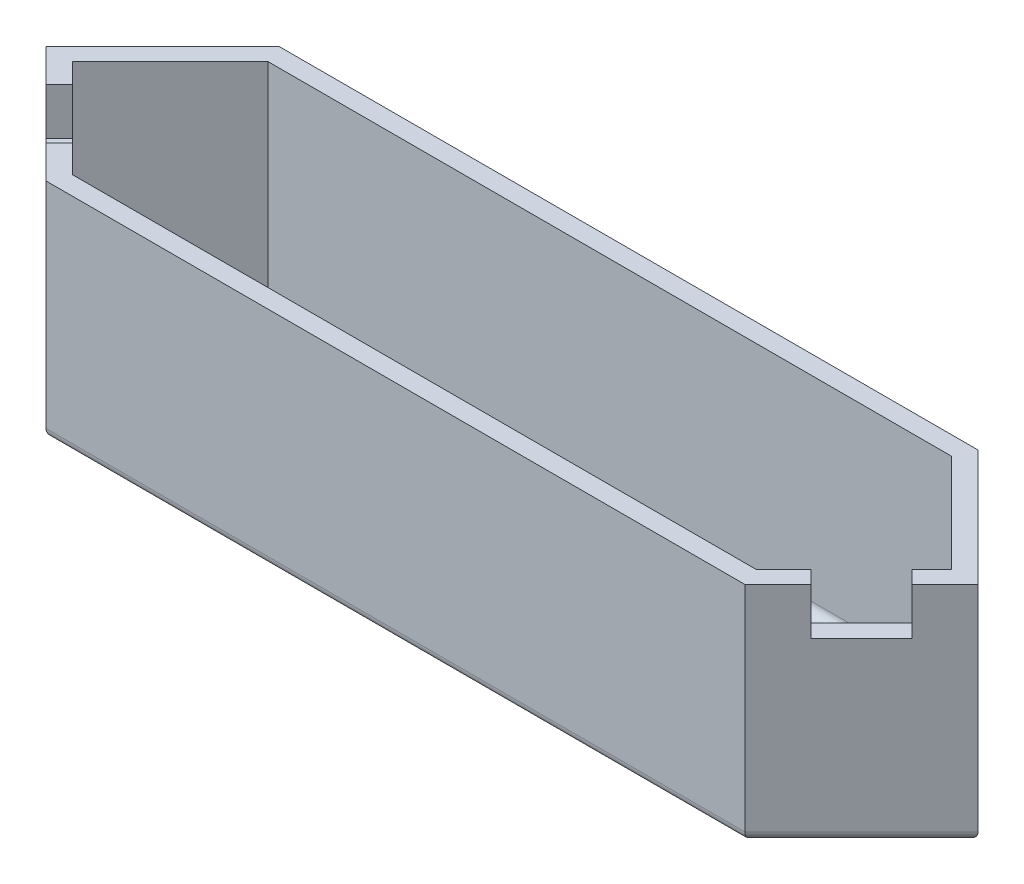
ISO-10303-21;
HEADER;
FILE_DESCRIPTION(('STEP AP214'),'2;1');
FILE_NAME('part.step','',(''),(''),'','','');
FILE_SCHEMA(('AUTOMOTIVE_DESIGN { 1 0 10303 214 1 1 1 1 }'));
ENDSEC;
DATA;
#1=APPLICATION_CONTEXT('core data for automotive mechanical design processes');
#2=APPLICATION_PROTOCOL_DEFINITION('international standard','automotive_design',2000,#1);
#3=PRODUCT_CONTEXT('',#1,'mechanical');
#4=PRODUCT('Part','Part','',(#3));
#5=PRODUCT_RELATED_PRODUCT_CATEGORY('part','',(#4));
#6=PRODUCT_DEFINITION_FORMATION('','',#4);
#7=PRODUCT_DEFINITION_CONTEXT('part definition',#1,'design');
#8=PRODUCT_DEFINITION('design','',#6,#7);
#9=PRODUCT_DEFINITION_SHAPE('','',#8);
#10=(LENGTH_UNIT() NAMED_UNIT(*) SI_UNIT(.MILLI.,.METRE.));
#11=(NAMED_UNIT(*) PLANE_ANGLE_UNIT() SI_UNIT($,.RADIAN.));
#12=(NAMED_UNIT(*) SI_UNIT($,.STERADIAN.) SOLID_ANGLE_UNIT());
#13=UNCERTAINTY_MEASURE_WITH_UNIT(LENGTH_MEASURE(1.E-05),#10,'distance_accuracy_value','');
#14=(GEOMETRIC_REPRESENTATION_CONTEXT(3) GLOBAL_UNCERTAINTY_ASSIGNED_CONTEXT((#13)) GLOBAL_UNIT_ASSIGNED_CONTEXT((#10,
#11,#12)) REPRESENTATION_CONTEXT('',''));
#15=CARTESIAN_POINT('',(0.,0.,0.));
#16=DIRECTION('',(0.,0.,1.));
#17=DIRECTION('',(1.,0.,0.));
#18=AXIS2_PLACEMENT_3D('',#15,#16,#17);
#19=CARTESIAN_POINT('',(0.,48.,0.));
#20=DIRECTION('',(0.,-1.,0.));
#21=DIRECTION('',(0.,0.,-1.));
#22=AXIS2_PLACEMENT_3D('',#19,#20,#21);
#23=PLANE('',#22);
#24=DIRECTION('',(-0.707106781186549,0.,0.707106781186546));
#25=VECTOR('',#24,1.);
#26=CARTESIAN_POINT('',(100.,48.,0.));
#27=LINE('',#26,#25);
#28=CARTESIAN_POINT('',(74.9999999999999,48.,25.));
#29=VERTEX_POINT('',#28);
#30=CARTESIAN_POINT('',(82.0710678118654,48.,17.9289321881345));
#31=VERTEX_POINT('',#30);
#32=EDGE_CURVE('E314',#29,#31,#27,.F.);
#33=ORIENTED_EDGE('',*,*,#32,.T.);
#34=DIRECTION('',(0.707106781186547,0.,0.707106781186548));
#35=VECTOR('',#34,1.);
#36=CARTESIAN_POINT('',(74.9999999999999,48.,10.8578643762691));
#37=LINE('',#36,#35);
#38=CARTESIAN_POINT('',(79.2426406871192,48.,15.1005050633884));
#39=VERTEX_POINT('',#38);
#40=EDGE_CURVE('E229',#39,#31,#37,.T.);
#41=ORIENTED_EDGE('',*,*,#40,.F.);
#42=DIRECTION('',(-0.707106781186547,0.,0.707106781186548));
#43=VECTOR('',#42,1.);
#44=CARTESIAN_POINT('',(47.1715728752538,48.,47.1715728752538));
#45=LINE('',#44,#43);
#46=CARTESIAN_POINT('',(73.3431457505076,48.,21.));
#47=VERTEX_POINT('',#46);
#48=EDGE_CURVE('E268',#39,#47,#45,.T.);
#49=ORIENTED_EDGE('',*,*,#48,.T.);
#50=DIRECTION('',(1.,0.,0.));
#51=VECTOR('',#50,1.);
#52=CARTESIAN_POINT('',(0.,48.,21.));
#53=LINE('',#52,#51);
#54=CARTESIAN_POINT('',(-73.3431457505075,48.,21.));
#55=VERTEX_POINT('',#54);
#56=EDGE_CURVE('E265',#55,#47,#53,.T.);
#57=ORIENTED_EDGE('',*,*,#56,.F.);
#58=DIRECTION('',(0.707106781186548,0.,0.707106781186547));
#59=VECTOR('',#58,1.);
#60=CARTESIAN_POINT('',(-47.1715728752536,48.,47.1715728752538));
#61=LINE('',#60,#59);
#62=CARTESIAN_POINT('',(-79.2426406871192,48.,15.1005050633883));
#63=VERTEX_POINT('',#62);
#64=EDGE_CURVE('E255',#63,#55,#61,.T.);
#65=ORIENTED_EDGE('',*,*,#64,.F.);
#66=DIRECTION('',(-0.707106781186548,0.,0.707106781186547));
#67=VECTOR('',#66,1.);
#68=CARTESIAN_POINT('',(-75.,48.,10.8578643762691));
#69=LINE('',#68,#67);
#70=CARTESIAN_POINT('',(-82.0710678118655,48.,17.9289321881345));
#71=VERTEX_POINT('',#70);
#72=EDGE_CURVE('E256',#63,#71,#69,.T.);
#73=ORIENTED_EDGE('',*,*,#72,.T.);
#74=DIRECTION('',(-0.707106781186546,0.,-0.707106781186549));
#75=VECTOR('',#74,1.);
#76=CARTESIAN_POINT('',(-75.,48.,25.));
#77=LINE('',#76,#75);
#78=CARTESIAN_POINT('',(-75.,48.,25.));
#79=VERTEX_POINT('',#78);
#80=EDGE_CURVE('E306',#71,#79,#77,.F.);
#81=ORIENTED_EDGE('',*,*,#80,.T.);
#82=DIRECTION('',(1.,0.,0.));
#83=VECTOR('',#82,1.);
#84=CARTESIAN_POINT('',(-100.,48.,25.));
#85=LINE('',#84,#83);
#86=EDGE_CURVE('E297',#79,#29,#85,.T.);
#87=ORIENTED_EDGE('',*,*,#86,.T.);
#88=EDGE_LOOP('',(#33,#41,#49,#57,#65,#73,#81,#87));
#89=FACE_BOUND('',#88,.T.);
#90=ADVANCED_FACE('F38',(#89),#23,.F.);
#91=CARTESIAN_POINT('',(-100.,48.,-25.));
#92=DIRECTION('',(0.,0.,1.));
#93=DIRECTION('',(1.,0.,0.));
#94=AXIS2_PLACEMENT_3D('',#91,#92,#93);
#95=PLANE('',#94);
#96=DIRECTION('',(0.,-1.,0.));
#97=VECTOR('',#96,1.);
#98=CARTESIAN_POINT('',(75.,48.,-25.));
#99=LINE('',#98,#97);
#100=CARTESIAN_POINT('',(75.,48.,-25.));
#101=VERTEX_POINT('',#100);
#102=CARTESIAN_POINT('',(75.,2.,-25.));
#103=VERTEX_POINT('',#102);
#104=EDGE_CURVE('E301',#101,#103,#99,.T.);
#105=ORIENTED_EDGE('',*,*,#104,.T.);
#106=DIRECTION('',(-1.,0.,0.));
#107=VECTOR('',#106,1.);
#108=CARTESIAN_POINT('',(-74.9999999999999,2.,-25.));
#109=LINE('',#108,#107);
#110=CARTESIAN_POINT('',(-74.9999999999999,2.,-25.));
#111=VERTEX_POINT('',#110);
#112=EDGE_CURVE('E398',#103,#111,#109,.T.);
#113=ORIENTED_EDGE('',*,*,#112,.T.);
#114=DIRECTION('',(0.,1.,0.));
#115=VECTOR('',#114,1.);
#116=CARTESIAN_POINT('',(-74.9999999999999,48.,-25.));
#117=LINE('',#116,#115);
#118=CARTESIAN_POINT('',(-74.9999999999999,48.,-25.));
#119=VERTEX_POINT('',#118);
#120=EDGE_CURVE('E304',#111,#119,#117,.T.);
#121=ORIENTED_EDGE('',*,*,#120,.T.);
#122=DIRECTION('',(-1.,0.,0.));
#123=VECTOR('',#122,1.);
#124=CARTESIAN_POINT('',(-100.,48.,-25.));
#125=LINE('',#124,#123);
#126=EDGE_CURVE('E294',#101,#119,#125,.T.);
#127=ORIENTED_EDGE('',*,*,#126,.F.);
#128=EDGE_LOOP('',(#105,#113,#121,#127));
#129=FACE_BOUND('',#128,.T.);
#130=ADVANCED_FACE('F433',(#129),#95,.F.);
#131=CARTESIAN_POINT('',(-100.,48.,25.));
#132=DIRECTION('',(0.,0.,-1.));
#133=DIRECTION('',(-1.,0.,0.));
#134=AXIS2_PLACEMENT_3D('',#131,#132,#133);
#135=PLANE('',#134);
#136=DIRECTION('',(0.,-1.,0.));
#137=VECTOR('',#136,1.);
#138=CARTESIAN_POINT('',(-75.,48.,25.));
#139=LINE('',#138,#137);
#140=CARTESIAN_POINT('',(-75.,2.,25.));
#141=VERTEX_POINT('',#140);
#142=EDGE_CURVE('E318',#79,#141,#139,.T.);
#143=ORIENTED_EDGE('',*,*,#142,.T.);
#144=DIRECTION('',(1.,0.,0.));
#145=VECTOR('',#144,1.);
#146=CARTESIAN_POINT('',(74.9999999999999,2.,25.));
#147=LINE('',#146,#145);
#148=CARTESIAN_POINT('',(74.9999999999999,2.,25.));
#149=VERTEX_POINT('',#148);
#150=EDGE_CURVE('E11',#141,#149,#147,.T.);
#151=ORIENTED_EDGE('',*,*,#150,.T.);
#152=DIRECTION('',(0.,1.,0.));
#153=VECTOR('',#152,1.);
#154=CARTESIAN_POINT('',(74.9999999999999,48.,25.));
#155=LINE('',#154,#153);
#156=EDGE_CURVE('E320',#149,#29,#155,.T.);
#157=ORIENTED_EDGE('',*,*,#156,.T.);
#158=ORIENTED_EDGE('',*,*,#86,.F.);
#159=EDGE_LOOP('',(#143,#151,#157,#158));
#160=FACE_BOUND('',#159,.T.);
#161=ADVANCED_FACE('F451',(#160),#135,.F.);
#162=CARTESIAN_POINT('',(94.3431457505076,48.,0.));
#163=VERTEX_POINT('',#162);
#164=CARTESIAN_POINT('',(90.1005050633883,48.,4.24264068711924));
#165=VERTEX_POINT('',#164);
#166=EDGE_CURVE('E269',#163,#165,#45,.T.);
#167=ORIENTED_EDGE('',*,*,#166,.T.);
#168=DIRECTION('',(0.707106781186547,0.,0.707106781186548));
#169=VECTOR('',#168,1.);
#170=CARTESIAN_POINT('',(85.857864376269,48.,0.));
#171=LINE('',#170,#169);
#172=CARTESIAN_POINT('',(92.9289321881345,48.,7.07106781186544));
#173=VERTEX_POINT('',#172);
#174=EDGE_CURVE('E241',#165,#173,#171,.T.);
#175=ORIENTED_EDGE('',*,*,#174,.T.);
#176=CARTESIAN_POINT('',(100.,48.,0.));
#177=VERTEX_POINT('',#176);
#178=EDGE_CURVE('E313',#173,#177,#27,.F.);
#179=ORIENTED_EDGE('',*,*,#178,.T.);
#180=DIRECTION('',(0.707106781186546,0.,0.707106781186549));
#181=VECTOR('',#180,1.);
#182=CARTESIAN_POINT('',(75.,48.,-25.));
#183=LINE('',#182,#181);
#184=EDGE_CURVE('E316',#177,#101,#183,.F.);
#185=ORIENTED_EDGE('',*,*,#184,.T.);
#186=ORIENTED_EDGE('',*,*,#126,.T.);
#187=DIRECTION('',(0.707106781186549,0.,-0.707106781186546));
#188=VECTOR('',#187,1.);
#189=CARTESIAN_POINT('',(-100.,48.,0.));
#190=LINE('',#189,#188);
#191=CARTESIAN_POINT('',(-100.,48.,0.));
#192=VERTEX_POINT('',#191);
#193=EDGE_CURVE('E310',#119,#192,#190,.F.);
#194=ORIENTED_EDGE('',*,*,#193,.T.);
#195=CARTESIAN_POINT('',(-92.9289321881346,48.,7.07106781186542));
#196=VERTEX_POINT('',#195);
#197=EDGE_CURVE('E307',#192,#196,#77,.F.);
#198=ORIENTED_EDGE('',*,*,#197,.T.);
#199=DIRECTION('',(-0.707106781186548,0.,0.707106781186547));
#200=VECTOR('',#199,1.);
#201=CARTESIAN_POINT('',(-85.8578643762691,48.,0.));
#202=LINE('',#201,#200);
#203=CARTESIAN_POINT('',(-90.1005050633884,48.,4.24264068711919));
#204=VERTEX_POINT('',#203);
#205=EDGE_CURVE('E253',#204,#196,#202,.T.);
#206=ORIENTED_EDGE('',*,*,#205,.F.);
#207=CARTESIAN_POINT('',(-94.3431457505075,48.,0.));
#208=VERTEX_POINT('',#207);
#209=EDGE_CURVE('E262',#208,#204,#61,.T.);
#210=ORIENTED_EDGE('',*,*,#209,.F.);
#211=DIRECTION('',(-0.707106781186548,0.,0.707106781186547));
#212=VECTOR('',#211,1.);
#213=CARTESIAN_POINT('',(-47.1715728752538,48.,-47.1715728752538));
#214=LINE('',#213,#212);
#215=CARTESIAN_POINT('',(-73.3431457505075,48.,-21.0000000000001));
#216=VERTEX_POINT('',#215);
#217=EDGE_CURVE('E278',#216,#208,#214,.T.);
#218=ORIENTED_EDGE('',*,*,#217,.F.);
#219=DIRECTION('',(1.,0.,0.));
#220=VECTOR('',#219,1.);
#221=CARTESIAN_POINT('',(0.,48.,-21.0000000000001));
#222=LINE('',#221,#220);
#223=CARTESIAN_POINT('',(73.3431457505076,48.,-21.));
#224=VERTEX_POINT('',#223);
#225=EDGE_CURVE('E275',#216,#224,#222,.T.);
#226=ORIENTED_EDGE('',*,*,#225,.T.);
#227=DIRECTION('',(0.707106781186548,0.,0.707106781186548));
#228=VECTOR('',#227,1.);
#229=CARTESIAN_POINT('',(47.1715728752538,48.,-47.1715728752538));
#230=LINE('',#229,#228);
#231=EDGE_CURVE('E272',#224,#163,#230,.T.);
#232=ORIENTED_EDGE('',*,*,#231,.T.);
#233=EDGE_LOOP('',(#167,#175,#179,#185,#186,#194,#198,#206,#210,#218,#226,#232));
#234=FACE_BOUND('',#233,.T.);
#235=ADVANCED_FACE('F437',(#234),#23,.F.);
#236=CARTESIAN_POINT('',(0.,0.,0.));
#237=DIRECTION('',(0.,-1.,0.));
#238=DIRECTION('',(0.,0.,-1.));
#239=AXIS2_PLACEMENT_3D('',#236,#237,#238);
#240=PLANE('',#239);
#241=DIRECTION('',(1.,0.,0.));
#242=VECTOR('',#241,1.);
#243=CARTESIAN_POINT('',(-75.,0.,23.));
#244=LINE('',#243,#242);
#245=CARTESIAN_POINT('',(74.1715728752537,0.,23.));
#246=VERTEX_POINT('',#245);
#247=CARTESIAN_POINT('',(-74.1715728752538,0.,23.));
#248=VERTEX_POINT('',#247);
#249=EDGE_CURVE('E365',#246,#248,#244,.F.);
#250=ORIENTED_EDGE('',*,*,#249,.T.);
#251=DIRECTION('',(0.707106781186546,0.,0.707106781186549));
#252=VECTOR('',#251,1.);
#253=CARTESIAN_POINT('',(-48.585786437627,0.,48.5857864376269));
#254=LINE('',#253,#252);
#255=CARTESIAN_POINT('',(-97.1715728752538,0.,0.));
#256=VERTEX_POINT('',#255);
#257=EDGE_CURVE('E390',#248,#256,#254,.F.);
#258=ORIENTED_EDGE('',*,*,#257,.T.);
#259=DIRECTION('',(-0.707106781186549,0.,0.707106781186546));
#260=VECTOR('',#259,1.);
#261=CARTESIAN_POINT('',(-48.5857864376267,0.,-48.5857864376269));
#262=LINE('',#261,#260);
#263=CARTESIAN_POINT('',(-74.1715728752537,0.,-23.));
#264=VERTEX_POINT('',#263);
#265=EDGE_CURVE('E388',#256,#264,#262,.F.);
#266=ORIENTED_EDGE('',*,*,#265,.T.);
#267=DIRECTION('',(-1.,0.,0.));
#268=VECTOR('',#267,1.);
#269=CARTESIAN_POINT('',(75.,0.,-23.));
#270=LINE('',#269,#268);
#271=CARTESIAN_POINT('',(74.1715728752538,0.,-23.));
#272=VERTEX_POINT('',#271);
#273=EDGE_CURVE('E386',#264,#272,#270,.F.);
#274=ORIENTED_EDGE('',*,*,#273,.T.);
#275=DIRECTION('',(-0.707106781186546,0.,-0.707106781186549));
#276=VECTOR('',#275,1.);
#277=CARTESIAN_POINT('',(48.585786437627,0.,-48.5857864376269));
#278=LINE('',#277,#276);
#279=CARTESIAN_POINT('',(97.1715728752538,0.,0.));
#280=VERTEX_POINT('',#279);
#281=EDGE_CURVE('E384',#272,#280,#278,.F.);
#282=ORIENTED_EDGE('',*,*,#281,.T.);
#283=DIRECTION('',(0.707106781186549,0.,-0.707106781186546));
#284=VECTOR('',#283,1.);
#285=CARTESIAN_POINT('',(48.5857864376267,0.,48.5857864376269));
#286=LINE('',#285,#284);
#287=EDGE_CURVE('E382',#280,#246,#286,.F.);
#288=ORIENTED_EDGE('',*,*,#287,.T.);
#289=EDGE_LOOP('',(#250,#258,#266,#274,#282,#288));
#290=FACE_BOUND('',#289,.T.);
#291=ADVANCED_FACE('F470',(#290),#240,.T.);
#292=CARTESIAN_POINT('',(-75.,48.,25.));
#293=DIRECTION('',(0.707106781186549,0.,-0.707106781186546));
#294=DIRECTION('',(0.,-1.,0.));
#295=AXIS2_PLACEMENT_3D('',#292,#293,#294);
#296=PLANE('',#295);
#297=DIRECTION('',(0.,1.,0.));
#298=VECTOR('',#297,1.);
#299=CARTESIAN_POINT('',(-100.,48.,0.));
#300=LINE('',#299,#298);
#301=CARTESIAN_POINT('',(-100.,2.,0.));
#302=VERTEX_POINT('',#301);
#303=EDGE_CURVE('E298',#302,#192,#300,.T.);
#304=ORIENTED_EDGE('',*,*,#303,.F.);
#305=DIRECTION('',(-0.707106781186546,0.,-0.707106781186549));
#306=VECTOR('',#305,1.);
#307=CARTESIAN_POINT('',(-75.,2.,25.));
#308=LINE('',#307,#306);
#309=EDGE_CURVE('E393',#302,#141,#308,.F.);
#310=ORIENTED_EDGE('',*,*,#309,.T.);
#311=ORIENTED_EDGE('',*,*,#142,.F.);
#312=ORIENTED_EDGE('',*,*,#80,.F.);
#313=DIRECTION('',(0.,1.,0.));
#314=VECTOR('',#313,1.);
#315=CARTESIAN_POINT('',(-82.0710678118655,48.,17.9289321881345));
#316=LINE('',#315,#314);
#317=CARTESIAN_POINT('',(-82.0710678118655,38.,17.9289321881345));
#318=VERTEX_POINT('',#317);
#319=EDGE_CURVE('E250',#318,#71,#316,.T.);
#320=ORIENTED_EDGE('',*,*,#319,.F.);
#321=DIRECTION('',(0.707106781186547,0.,0.707106781186548));
#322=VECTOR('',#321,1.);
#323=CARTESIAN_POINT('',(-92.9289321881346,38.,7.07106781186542));
#324=LINE('',#323,#322);
#325=CARTESIAN_POINT('',(-92.9289321881346,38.,7.07106781186542));
#326=VERTEX_POINT('',#325);
#327=EDGE_CURVE('E247',#326,#318,#324,.T.);
#328=ORIENTED_EDGE('',*,*,#327,.F.);
#329=DIRECTION('',(0.,-1.,0.));
#330=VECTOR('',#329,1.);
#331=CARTESIAN_POINT('',(-92.9289321881346,48.,7.07106781186542));
#332=LINE('',#331,#330);
#333=EDGE_CURVE('E240',#196,#326,#332,.T.);
#334=ORIENTED_EDGE('',*,*,#333,.F.);
#335=ORIENTED_EDGE('',*,*,#197,.F.);
#336=EDGE_LOOP('',(#304,#310,#311,#312,#320,#328,#334,#335));
#337=FACE_BOUND('',#336,.T.);
#338=ADVANCED_FACE('F456',(#337),#296,.F.);
#339=CARTESIAN_POINT('',(-100.,48.,0.));
#340=DIRECTION('',(0.707106781186546,0.,0.707106781186549));
#341=DIRECTION('',(0.,-1.,0.));
#342=AXIS2_PLACEMENT_3D('',#339,#340,#341);
#343=PLANE('',#342);
#344=ORIENTED_EDGE('',*,*,#120,.F.);
#345=DIRECTION('',(0.707106781186549,0.,-0.707106781186546));
#346=VECTOR('',#345,1.);
#347=CARTESIAN_POINT('',(-100.,2.,0.));
#348=LINE('',#347,#346);
#349=EDGE_CURVE('E396',#111,#302,#348,.F.);
#350=ORIENTED_EDGE('',*,*,#349,.T.);
#351=ORIENTED_EDGE('',*,*,#303,.T.);
#352=ORIENTED_EDGE('',*,*,#193,.F.);
#353=EDGE_LOOP('',(#344,#350,#351,#352));
#354=FACE_BOUND('',#353,.T.);
#355=ADVANCED_FACE('F502',(#354),#343,.F.);
#356=CARTESIAN_POINT('',(100.,48.,0.));
#357=DIRECTION('',(-0.707106781186546,0.,-0.707106781186549));
#358=DIRECTION('',(0.,-1.,0.));
#359=AXIS2_PLACEMENT_3D('',#356,#357,#358);
#360=PLANE('',#359);
#361=ORIENTED_EDGE('',*,*,#156,.F.);
#362=DIRECTION('',(-0.707106781186549,0.,0.707106781186546));
#363=VECTOR('',#362,1.);
#364=CARTESIAN_POINT('',(100.,2.,0.));
#365=LINE('',#364,#363);
#366=CARTESIAN_POINT('',(100.,2.,0.));
#367=VERTEX_POINT('',#366);
#368=EDGE_CURVE('E47',#149,#367,#365,.F.);
#369=ORIENTED_EDGE('',*,*,#368,.T.);
#370=DIRECTION('',(0.,-1.,0.));
#371=VECTOR('',#370,1.);
#372=CARTESIAN_POINT('',(100.,48.,0.));
#373=LINE('',#372,#371);
#374=EDGE_CURVE('E284',#177,#367,#373,.T.);
#375=ORIENTED_EDGE('',*,*,#374,.F.);
#376=ORIENTED_EDGE('',*,*,#178,.F.);
#377=DIRECTION('',(0.,1.,0.));
#378=VECTOR('',#377,1.);
#379=CARTESIAN_POINT('',(92.9289321881345,48.,7.07106781186544));
#380=LINE('',#379,#378);
#381=CARTESIAN_POINT('',(92.9289321881345,38.,7.07106781186544));
#382=VERTEX_POINT('',#381);
#383=EDGE_CURVE('E223',#382,#173,#380,.T.);
#384=ORIENTED_EDGE('',*,*,#383,.F.);
#385=DIRECTION('',(0.707106781186548,0.,-0.707106781186547));
#386=VECTOR('',#385,1.);
#387=CARTESIAN_POINT('',(82.0710678118654,38.,17.9289321881345));
#388=LINE('',#387,#386);
#389=CARTESIAN_POINT('',(82.0710678118654,38.,17.9289321881345));
#390=VERTEX_POINT('',#389);
#391=EDGE_CURVE('E216',#390,#382,#388,.T.);
#392=ORIENTED_EDGE('',*,*,#391,.F.);
#393=DIRECTION('',(0.,-1.,0.));
#394=VECTOR('',#393,1.);
#395=CARTESIAN_POINT('',(82.0710678118654,48.,17.9289321881345));
#396=LINE('',#395,#394);
#397=EDGE_CURVE('E226',#31,#390,#396,.T.);
#398=ORIENTED_EDGE('',*,*,#397,.F.);
#399=ORIENTED_EDGE('',*,*,#32,.F.);
#400=EDGE_LOOP('',(#361,#369,#375,#376,#384,#392,#398,#399));
#401=FACE_BOUND('',#400,.T.);
#402=ADVANCED_FACE('F234',(#401),#360,.F.);
#403=CARTESIAN_POINT('',(75.,48.,-25.));
#404=DIRECTION('',(-0.707106781186549,0.,0.707106781186546));
#405=DIRECTION('',(0.,-1.,0.));
#406=AXIS2_PLACEMENT_3D('',#403,#404,#405);
#407=PLANE('',#406);
#408=ORIENTED_EDGE('',*,*,#374,.T.);
#409=DIRECTION('',(0.707106781186546,0.,0.707106781186549));
#410=VECTOR('',#409,1.);
#411=CARTESIAN_POINT('',(75.,2.,-25.));
#412=LINE('',#411,#410);
#413=EDGE_CURVE('E400',#367,#103,#412,.F.);
#414=ORIENTED_EDGE('',*,*,#413,.T.);
#415=ORIENTED_EDGE('',*,*,#104,.F.);
#416=ORIENTED_EDGE('',*,*,#184,.F.);
#417=EDGE_LOOP('',(#408,#414,#415,#416));
#418=FACE_BOUND('',#417,.T.);
#419=ADVANCED_FACE('F429',(#418),#407,.F.);
#420=CARTESIAN_POINT('',(-47.1715728752536,4.,47.1715728752538));
#421=DIRECTION('',(-0.707106781186547,0.,0.707106781186548));
#422=DIRECTION('',(0.707106781186548,0.,0.707106781186547));
#423=AXIS2_PLACEMENT_3D('',#420,#421,#422);
#424=PLANE('',#423);
#425=DIRECTION('',(0.,1.,0.));
#426=VECTOR('',#425,1.);
#427=CARTESIAN_POINT('',(-73.3431457505075,4.,21.));
#428=LINE('',#427,#426);
#429=CARTESIAN_POINT('',(-73.3431457505075,6.,21.));
#430=VERTEX_POINT('',#429);
#431=EDGE_CURVE('E281',#430,#55,#428,.T.);
#432=ORIENTED_EDGE('',*,*,#431,.F.);
#433=DIRECTION('',(0.707106781186548,0.,0.707106781186547));
#434=VECTOR('',#433,1.);
#435=CARTESIAN_POINT('',(-47.1715728752536,6.,47.1715728752538));
#436=LINE('',#435,#434);
#437=CARTESIAN_POINT('',(-94.3431457505075,6.,0.));
#438=VERTEX_POINT('',#437);
#439=EDGE_CURVE('E361',#430,#438,#436,.F.);
#440=ORIENTED_EDGE('',*,*,#439,.T.);
#441=DIRECTION('',(0.,1.,0.));
#442=VECTOR('',#441,1.);
#443=CARTESIAN_POINT('',(-94.3431457505075,4.,0.));
#444=LINE('',#443,#442);
#445=EDGE_CURVE('E282',#438,#208,#444,.T.);
#446=ORIENTED_EDGE('',*,*,#445,.T.);
#447=ORIENTED_EDGE('',*,*,#209,.T.);
#448=DIRECTION('',(0.,-1.,0.));
#449=VECTOR('',#448,1.);
#450=CARTESIAN_POINT('',(-90.1005050633884,4.,4.24264068711919));
#451=LINE('',#450,#449);
#452=CARTESIAN_POINT('',(-90.1005050633884,38.,4.24264068711919));
#453=VERTEX_POINT('',#452);
#454=EDGE_CURVE('E330',#204,#453,#451,.T.);
#455=ORIENTED_EDGE('',*,*,#454,.T.);
#456=DIRECTION('',(0.707106781186548,0.,0.707106781186547));
#457=VECTOR('',#456,1.);
#458=CARTESIAN_POINT('',(-47.1715728752536,38.,47.1715728752538));
#459=LINE('',#458,#457);
#460=CARTESIAN_POINT('',(-79.2426406871192,38.,15.1005050633883));
#461=VERTEX_POINT('',#460);
#462=EDGE_CURVE('E322',#453,#461,#459,.T.);
#463=ORIENTED_EDGE('',*,*,#462,.T.);
#464=DIRECTION('',(0.,1.,0.));
#465=VECTOR('',#464,1.);
#466=CARTESIAN_POINT('',(-79.2426406871192,4.,15.1005050633883));
#467=LINE('',#466,#465);
#468=EDGE_CURVE('E327',#461,#63,#467,.T.);
#469=ORIENTED_EDGE('',*,*,#468,.T.);
#470=ORIENTED_EDGE('',*,*,#64,.T.);
#471=EDGE_LOOP('',(#432,#440,#446,#447,#455,#463,#469,#470));
#472=FACE_BOUND('',#471,.T.);
#473=ADVANCED_FACE('F510',(#472),#424,.F.);
#474=CARTESIAN_POINT('',(-47.1715728752538,4.,-47.1715728752538));
#475=DIRECTION('',(-0.707106781186547,0.,-0.707106781186548));
#476=DIRECTION('',(-0.707106781186548,0.,0.707106781186547));
#477=AXIS2_PLACEMENT_3D('',#474,#475,#476);
#478=PLANE('',#477);
#479=ORIENTED_EDGE('',*,*,#445,.F.);
#480=DIRECTION('',(-0.707106781186548,0.,0.707106781186547));
#481=VECTOR('',#480,1.);
#482=CARTESIAN_POINT('',(-47.1715728752538,6.,-47.1715728752538));
#483=LINE('',#482,#481);
#484=CARTESIAN_POINT('',(-73.3431457505075,6.,-21.0000000000001));
#485=VERTEX_POINT('',#484);
#486=EDGE_CURVE('E359',#438,#485,#483,.F.);
#487=ORIENTED_EDGE('',*,*,#486,.T.);
#488=DIRECTION('',(0.,1.,0.));
#489=VECTOR('',#488,1.);
#490=CARTESIAN_POINT('',(-73.3431457505075,4.,-21.0000000000001));
#491=LINE('',#490,#489);
#492=EDGE_CURVE('E285',#485,#216,#491,.T.);
#493=ORIENTED_EDGE('',*,*,#492,.T.);
#494=ORIENTED_EDGE('',*,*,#217,.T.);
#495=EDGE_LOOP('',(#479,#487,#493,#494));
#496=FACE_BOUND('',#495,.T.);
#497=ADVANCED_FACE('F612',(#496),#478,.F.);
#498=CARTESIAN_POINT('',(0.,4.,-21.0000000000001));
#499=DIRECTION('',(0.,0.,1.));
#500=DIRECTION('',(1.,0.,0.));
#501=AXIS2_PLACEMENT_3D('',#498,#499,#500);
#502=PLANE('',#501);
#503=ORIENTED_EDGE('',*,*,#492,.F.);
#504=DIRECTION('',(1.,0.,0.));
#505=VECTOR('',#504,1.);
#506=CARTESIAN_POINT('',(73.3431457505076,6.,-21.0000000000001));
#507=LINE('',#506,#505);
#508=CARTESIAN_POINT('',(73.3431457505076,6.,-21.));
#509=VERTEX_POINT('',#508);
#510=EDGE_CURVE('E357',#485,#509,#507,.T.);
#511=ORIENTED_EDGE('',*,*,#510,.T.);
#512=DIRECTION('',(0.,1.,0.));
#513=VECTOR('',#512,1.);
#514=CARTESIAN_POINT('',(73.3431457505076,4.,-21.));
#515=LINE('',#514,#513);
#516=EDGE_CURVE('E287',#509,#224,#515,.T.);
#517=ORIENTED_EDGE('',*,*,#516,.T.);
#518=ORIENTED_EDGE('',*,*,#225,.F.);
#519=EDGE_LOOP('',(#503,#511,#517,#518));
#520=FACE_BOUND('',#519,.T.);
#521=ADVANCED_FACE('F620',(#520),#502,.T.);
#522=CARTESIAN_POINT('',(47.1715728752538,4.,-47.1715728752538));
#523=DIRECTION('',(-0.707106781186548,0.,0.707106781186548));
#524=DIRECTION('',(0.707106781186548,0.,0.707106781186548));
#525=AXIS2_PLACEMENT_3D('',#522,#523,#524);
#526=PLANE('',#525);
#527=ORIENTED_EDGE('',*,*,#516,.F.);
#528=DIRECTION('',(0.707106781186548,0.,0.707106781186548));
#529=VECTOR('',#528,1.);
#530=CARTESIAN_POINT('',(94.3431457505076,6.,0.));
#531=LINE('',#530,#529);
#532=CARTESIAN_POINT('',(94.3431457505076,6.,0.));
#533=VERTEX_POINT('',#532);
#534=EDGE_CURVE('E355',#509,#533,#531,.T.);
#535=ORIENTED_EDGE('',*,*,#534,.T.);
#536=DIRECTION('',(0.,1.,0.));
#537=VECTOR('',#536,1.);
#538=CARTESIAN_POINT('',(94.3431457505076,4.,0.));
#539=LINE('',#538,#537);
#540=EDGE_CURVE('E289',#533,#163,#539,.T.);
#541=ORIENTED_EDGE('',*,*,#540,.T.);
#542=ORIENTED_EDGE('',*,*,#231,.F.);
#543=EDGE_LOOP('',(#527,#535,#541,#542));
#544=FACE_BOUND('',#543,.T.);
#545=ADVANCED_FACE('F629',(#544),#526,.T.);
#546=CARTESIAN_POINT('',(47.1715728752538,4.,47.1715728752538));
#547=DIRECTION('',(-0.707106781186548,0.,-0.707106781186547));
#548=DIRECTION('',(-0.707106781186547,0.,0.707106781186548));
#549=AXIS2_PLACEMENT_3D('',#546,#547,#548);
#550=PLANE('',#549);
#551=ORIENTED_EDGE('',*,*,#540,.F.);
#552=DIRECTION('',(-0.707106781186547,0.,0.707106781186548));
#553=VECTOR('',#552,1.);
#554=CARTESIAN_POINT('',(73.3431457505076,6.,21.));
#555=LINE('',#554,#553);
#556=CARTESIAN_POINT('',(73.3431457505076,6.,21.));
#557=VERTEX_POINT('',#556);
#558=EDGE_CURVE('E339',#533,#557,#555,.T.);
#559=ORIENTED_EDGE('',*,*,#558,.T.);
#560=DIRECTION('',(0.,1.,0.));
#561=VECTOR('',#560,1.);
#562=CARTESIAN_POINT('',(73.3431457505076,4.,21.));
#563=LINE('',#562,#561);
#564=EDGE_CURVE('E291',#557,#47,#563,.T.);
#565=ORIENTED_EDGE('',*,*,#564,.T.);
#566=ORIENTED_EDGE('',*,*,#48,.F.);
#567=DIRECTION('',(0.,1.,0.));
#568=VECTOR('',#567,1.);
#569=CARTESIAN_POINT('',(79.2426406871192,4.,15.1005050633884));
#570=LINE('',#569,#568);
#571=CARTESIAN_POINT('',(79.2426406871192,38.,15.1005050633884));
#572=VERTEX_POINT('',#571);
#573=EDGE_CURVE('E337',#572,#39,#570,.T.);
#574=ORIENTED_EDGE('',*,*,#573,.F.);
#575=DIRECTION('',(-0.707106781186547,0.,0.707106781186548));
#576=VECTOR('',#575,1.);
#577=CARTESIAN_POINT('',(47.1715728752538,38.,47.1715728752538));
#578=LINE('',#577,#576);
#579=CARTESIAN_POINT('',(90.1005050633883,38.,4.24264068711924));
#580=VERTEX_POINT('',#579);
#581=EDGE_CURVE('E219',#580,#572,#578,.T.);
#582=ORIENTED_EDGE('',*,*,#581,.F.);
#583=DIRECTION('',(0.,-1.,0.));
#584=VECTOR('',#583,1.);
#585=CARTESIAN_POINT('',(90.1005050633883,4.,4.24264068711923));
#586=LINE('',#585,#584);
#587=EDGE_CURVE('E334',#165,#580,#586,.T.);
#588=ORIENTED_EDGE('',*,*,#587,.F.);
#589=ORIENTED_EDGE('',*,*,#166,.F.);
#590=EDGE_LOOP('',(#551,#559,#565,#566,#574,#582,#588,#589));
#591=FACE_BOUND('',#590,.T.);
#592=ADVANCED_FACE('F445',(#591),#550,.T.);
#593=CARTESIAN_POINT('',(0.,4.,21.));
#594=DIRECTION('',(0.,0.,1.));
#595=DIRECTION('',(1.,0.,0.));
#596=AXIS2_PLACEMENT_3D('',#593,#594,#595);
#597=PLANE('',#596);
#598=ORIENTED_EDGE('',*,*,#564,.F.);
#599=DIRECTION('',(1.,0.,0.));
#600=VECTOR('',#599,1.);
#601=CARTESIAN_POINT('',(0.,6.,21.));
#602=LINE('',#601,#600);
#603=EDGE_CURVE('E363',#557,#430,#602,.F.);
#604=ORIENTED_EDGE('',*,*,#603,.T.);
#605=ORIENTED_EDGE('',*,*,#431,.T.);
#606=ORIENTED_EDGE('',*,*,#56,.T.);
#607=EDGE_LOOP('',(#598,#604,#605,#606));
#608=FACE_BOUND('',#607,.T.);
#609=ADVANCED_FACE('F646',(#608),#597,.F.);
#610=CARTESIAN_POINT('',(0.,4.,0.));
#611=DIRECTION('',(0.,1.,0.));
#612=DIRECTION('',(0.,0.,1.));
#613=AXIS2_PLACEMENT_3D('',#610,#611,#612);
#614=PLANE('',#613);
#615=DIRECTION('',(1.,0.,0.));
#616=VECTOR('',#615,1.);
#617=CARTESIAN_POINT('',(0.,4.,19.));
#618=LINE('',#617,#616);
#619=CARTESIAN_POINT('',(-72.5147186257613,4.,19.));
#620=VERTEX_POINT('',#619);
#621=CARTESIAN_POINT('',(72.5147186257613,4.,19.));
#622=VERTEX_POINT('',#621);
#623=EDGE_CURVE('E342',#620,#622,#618,.T.);
#624=ORIENTED_EDGE('',*,*,#623,.T.);
#625=DIRECTION('',(-0.707106781186547,0.,0.707106781186548));
#626=VECTOR('',#625,1.);
#627=CARTESIAN_POINT('',(92.9289321881345,4.,-1.41421356237313));
#628=LINE('',#627,#626);
#629=CARTESIAN_POINT('',(91.5147186257614,4.,0.));
#630=VERTEX_POINT('',#629);
#631=EDGE_CURVE('E352',#622,#630,#628,.F.);
#632=ORIENTED_EDGE('',*,*,#631,.T.);
#633=DIRECTION('',(0.707106781186548,0.,0.707106781186548));
#634=VECTOR('',#633,1.);
#635=CARTESIAN_POINT('',(71.9289321881345,4.,-19.5857864376269));
#636=LINE('',#635,#634);
#637=CARTESIAN_POINT('',(72.5147186257614,4.,-19.0000000000001));
#638=VERTEX_POINT('',#637);
#639=EDGE_CURVE('E350',#630,#638,#636,.F.);
#640=ORIENTED_EDGE('',*,*,#639,.T.);
#641=DIRECTION('',(1.,0.,0.));
#642=VECTOR('',#641,1.);
#643=CARTESIAN_POINT('',(-73.3431457505075,4.,-19.0000000000001));
#644=LINE('',#643,#642);
#645=CARTESIAN_POINT('',(-72.5147186257613,4.,-19.0000000000001));
#646=VERTEX_POINT('',#645);
#647=EDGE_CURVE('E348',#638,#646,#644,.F.);
#648=ORIENTED_EDGE('',*,*,#647,.T.);
#649=DIRECTION('',(-0.707106781186548,0.,0.707106781186547));
#650=VECTOR('',#649,1.);
#651=CARTESIAN_POINT('',(-45.7573593128807,4.,-45.7573593128807));
#652=LINE('',#651,#650);
#653=CARTESIAN_POINT('',(-91.5147186257614,4.,0.));
#654=VERTEX_POINT('',#653);
#655=EDGE_CURVE('E346',#646,#654,#652,.T.);
#656=ORIENTED_EDGE('',*,*,#655,.T.);
#657=DIRECTION('',(0.707106781186548,0.,0.707106781186547));
#658=VECTOR('',#657,1.);
#659=CARTESIAN_POINT('',(-45.7573593128806,4.,45.7573593128807));
#660=LINE('',#659,#658);
#661=EDGE_CURVE('E344',#654,#620,#660,.T.);
#662=ORIENTED_EDGE('',*,*,#661,.T.);
#663=EDGE_LOOP('',(#624,#632,#640,#648,#656,#662));
#664=FACE_BOUND('',#663,.T.);
#665=ADVANCED_FACE('F654',(#664),#614,.T.);
#666=CARTESIAN_POINT('',(-85.8578643762691,48.,0.));
#667=DIRECTION('',(-0.707106781186547,0.,-0.707106781186548));
#668=DIRECTION('',(-0.707106781186548,0.,0.707106781186547));
#669=AXIS2_PLACEMENT_3D('',#666,#667,#668);
#670=PLANE('',#669);
#671=ORIENTED_EDGE('',*,*,#205,.T.);
#672=ORIENTED_EDGE('',*,*,#333,.T.);
#673=DIRECTION('',(-0.707106781186548,0.,0.707106781186547));
#674=VECTOR('',#673,1.);
#675=CARTESIAN_POINT('',(-85.8578643762691,38.,0.));
#676=LINE('',#675,#674);
#677=EDGE_CURVE('E252',#453,#326,#676,.T.);
#678=ORIENTED_EDGE('',*,*,#677,.F.);
#679=ORIENTED_EDGE('',*,*,#454,.F.);
#680=EDGE_LOOP('',(#671,#672,#678,#679));
#681=FACE_BOUND('',#680,.T.);
#682=ADVANCED_FACE('F663',(#681),#670,.F.);
#683=CARTESIAN_POINT('',(-75.,48.,10.8578643762691));
#684=DIRECTION('',(0.707106781186547,0.,0.707106781186548));
#685=DIRECTION('',(0.707106781186548,0.,-0.707106781186547));
#686=AXIS2_PLACEMENT_3D('',#683,#684,#685);
#687=PLANE('',#686);
#688=DIRECTION('',(-0.707106781186548,0.,0.707106781186547));
#689=VECTOR('',#688,1.);
#690=CARTESIAN_POINT('',(-75.,38.,10.8578643762691));
#691=LINE('',#690,#689);
#692=EDGE_CURVE('E259',#461,#318,#691,.T.);
#693=ORIENTED_EDGE('',*,*,#692,.T.);
#694=ORIENTED_EDGE('',*,*,#319,.T.);
#695=ORIENTED_EDGE('',*,*,#72,.F.);
#696=ORIENTED_EDGE('',*,*,#468,.F.);
#697=EDGE_LOOP('',(#693,#694,#695,#696));
#698=FACE_BOUND('',#697,.T.);
#699=ADVANCED_FACE('F678',(#698),#687,.F.);
#700=CARTESIAN_POINT('',(-85.8578643762691,38.,0.));
#701=DIRECTION('',(0.,-1.,0.));
#702=DIRECTION('',(0.,0.,-1.));
#703=AXIS2_PLACEMENT_3D('',#700,#701,#702);
#704=PLANE('',#703);
#705=ORIENTED_EDGE('',*,*,#677,.T.);
#706=ORIENTED_EDGE('',*,*,#327,.T.);
#707=ORIENTED_EDGE('',*,*,#692,.F.);
#708=ORIENTED_EDGE('',*,*,#462,.F.);
#709=EDGE_LOOP('',(#705,#706,#707,#708));
#710=FACE_BOUND('',#709,.T.);
#711=ADVANCED_FACE('F687',(#710),#704,.F.);
#712=CARTESIAN_POINT('',(74.9999999999999,48.,10.8578643762691));
#713=DIRECTION('',(-0.707106781186548,0.,0.707106781186547));
#714=DIRECTION('',(0.707106781186547,0.,0.707106781186548));
#715=AXIS2_PLACEMENT_3D('',#712,#713,#714);
#716=PLANE('',#715);
#717=ORIENTED_EDGE('',*,*,#573,.T.);
#718=ORIENTED_EDGE('',*,*,#40,.T.);
#719=ORIENTED_EDGE('',*,*,#397,.T.);
#720=DIRECTION('',(0.707106781186547,0.,0.707106781186548));
#721=VECTOR('',#720,1.);
#722=CARTESIAN_POINT('',(74.9999999999999,38.,10.8578643762691));
#723=LINE('',#722,#721);
#724=EDGE_CURVE('E212',#572,#390,#723,.T.);
#725=ORIENTED_EDGE('',*,*,#724,.F.);
#726=EDGE_LOOP('',(#717,#718,#719,#725));
#727=FACE_BOUND('',#726,.T.);
#728=ADVANCED_FACE('F227',(#727),#716,.F.);
#729=CARTESIAN_POINT('',(85.857864376269,48.,0.));
#730=DIRECTION('',(0.707106781186548,0.,-0.707106781186547));
#731=DIRECTION('',(-0.707106781186547,0.,-0.707106781186548));
#732=AXIS2_PLACEMENT_3D('',#729,#730,#731);
#733=PLANE('',#732);
#734=ORIENTED_EDGE('',*,*,#587,.T.);
#735=DIRECTION('',(0.707106781186547,0.,0.707106781186548));
#736=VECTOR('',#735,1.);
#737=CARTESIAN_POINT('',(85.857864376269,38.,0.));
#738=LINE('',#737,#736);
#739=EDGE_CURVE('E222',#580,#382,#738,.T.);
#740=ORIENTED_EDGE('',*,*,#739,.T.);
#741=ORIENTED_EDGE('',*,*,#383,.T.);
#742=ORIENTED_EDGE('',*,*,#174,.F.);
#743=EDGE_LOOP('',(#734,#740,#741,#742));
#744=FACE_BOUND('',#743,.T.);
#745=ADVANCED_FACE('F442',(#744),#733,.F.);
#746=CARTESIAN_POINT('',(74.9999999999999,38.,10.8578643762691));
#747=DIRECTION('',(0.,-1.,0.));
#748=DIRECTION('',(0.,0.,-1.));
#749=AXIS2_PLACEMENT_3D('',#746,#747,#748);
#750=PLANE('',#749);
#751=ORIENTED_EDGE('',*,*,#581,.T.);
#752=ORIENTED_EDGE('',*,*,#724,.T.);
#753=ORIENTED_EDGE('',*,*,#391,.T.);
#754=ORIENTED_EDGE('',*,*,#739,.F.);
#755=EDGE_LOOP('',(#751,#752,#753,#754));
#756=FACE_BOUND('',#755,.T.);
#757=ADVANCED_FACE('F214',(#756),#750,.F.);
#758=CARTESIAN_POINT('',(-45.7573593128807,6.,-45.7573593128807));
#759=DIRECTION('',(-0.707106781186548,0.,0.707106781186547));
#760=DIRECTION('',(0.707106781186547,0.,0.707106781186548));
#761=AXIS2_PLACEMENT_3D('',#758,#759,#760);
#762=CYLINDRICAL_SURFACE('',#761,2.);
#763=CARTESIAN_POINT('',(-91.5147186257614,6.,0.));
#764=DIRECTION('',(0.,0.,1.));
#765=DIRECTION('',(-1.,0.,0.));
#766=AXIS2_PLACEMENT_3D('',#763,#764,#765);
#767=ELLIPSE('',#766,2.82842712474619,2.);
#768=EDGE_CURVE('E376',#654,#438,#767,.F.);
#769=ORIENTED_EDGE('',*,*,#768,.F.);
#770=ORIENTED_EDGE('',*,*,#655,.F.);
#771=CARTESIAN_POINT('',(-72.5147186257613,6.,-19.0000000000001));
#772=DIRECTION('',(-0.923879532511287,0.,0.38268343236509));
#773=DIRECTION('',(-0.38268343236509,0.,-0.923879532511287));
#774=AXIS2_PLACEMENT_3D('',#771,#772,#773);
#775=ELLIPSE('',#774,2.16478440058479,2.);
#776=EDGE_CURVE('E232',#485,#646,#775,.T.);
#777=ORIENTED_EDGE('',*,*,#776,.F.);
#778=ORIENTED_EDGE('',*,*,#486,.F.);
#779=EDGE_LOOP('',(#769,#770,#777,#778));
#780=FACE_BOUND('',#779,.T.);
#781=ADVANCED_FACE('F532',(#780),#762,.F.);
#782=CARTESIAN_POINT('',(0.,6.,-19.0000000000001));
#783=DIRECTION('',(-1.,0.,0.));
#784=DIRECTION('',(0.,0.,1.));
#785=AXIS2_PLACEMENT_3D('',#782,#783,#784);
#786=CYLINDRICAL_SURFACE('',#785,2.);
#787=ORIENTED_EDGE('',*,*,#776,.T.);
#788=ORIENTED_EDGE('',*,*,#647,.F.);
#789=CARTESIAN_POINT('',(72.5147186257614,6.,-19.0000000000001));
#790=DIRECTION('',(-0.923879532511287,0.,-0.38268343236509));
#791=DIRECTION('',(0.38268343236509,0.,-0.923879532511287));
#792=AXIS2_PLACEMENT_3D('',#789,#790,#791);
#793=ELLIPSE('',#792,2.16478440058479,2.);
#794=EDGE_CURVE('E373',#509,#638,#793,.T.);
#795=ORIENTED_EDGE('',*,*,#794,.F.);
#796=ORIENTED_EDGE('',*,*,#510,.F.);
#797=EDGE_LOOP('',(#787,#788,#795,#796));
#798=FACE_BOUND('',#797,.T.);
#799=ADVANCED_FACE('F528',(#798),#786,.F.);
#800=CARTESIAN_POINT('',(-45.7573593128806,6.,45.7573593128807));
#801=DIRECTION('',(0.707106781186548,0.,0.707106781186547));
#802=DIRECTION('',(0.707106781186547,0.,-0.707106781186548));
#803=AXIS2_PLACEMENT_3D('',#800,#801,#802);
#804=CYLINDRICAL_SURFACE('',#803,2.);
#805=ORIENTED_EDGE('',*,*,#768,.T.);
#806=ORIENTED_EDGE('',*,*,#439,.F.);
#807=CARTESIAN_POINT('',(-72.5147186257613,6.,19.));
#808=DIRECTION('',(0.923879532511287,0.,0.382683432365089));
#809=DIRECTION('',(-0.382683432365089,0.,0.923879532511287));
#810=AXIS2_PLACEMENT_3D('',#807,#808,#809);
#811=ELLIPSE('',#810,2.16478440058479,2.);
#812=EDGE_CURVE('E370',#620,#430,#811,.F.);
#813=ORIENTED_EDGE('',*,*,#812,.F.);
#814=ORIENTED_EDGE('',*,*,#661,.F.);
#815=EDGE_LOOP('',(#805,#806,#813,#814));
#816=FACE_BOUND('',#815,.T.);
#817=ADVANCED_FACE('F524',(#816),#804,.F.);
#818=CARTESIAN_POINT('',(45.7573593128807,6.,-45.7573593128807));
#819=DIRECTION('',(-0.707106781186548,0.,-0.707106781186548));
#820=DIRECTION('',(-0.707106781186548,0.,0.707106781186548));
#821=AXIS2_PLACEMENT_3D('',#818,#819,#820);
#822=CYLINDRICAL_SURFACE('',#821,2.);
#823=ORIENTED_EDGE('',*,*,#794,.T.);
#824=ORIENTED_EDGE('',*,*,#639,.F.);
#825=CARTESIAN_POINT('',(91.5147186257614,6.,0.));
#826=DIRECTION('',(0.,0.,-1.));
#827=DIRECTION('',(1.,0.,0.));
#828=AXIS2_PLACEMENT_3D('',#825,#826,#827);
#829=ELLIPSE('',#828,2.82842712474619,2.);
#830=EDGE_CURVE('E368',#533,#630,#829,.T.);
#831=ORIENTED_EDGE('',*,*,#830,.F.);
#832=ORIENTED_EDGE('',*,*,#534,.F.);
#833=EDGE_LOOP('',(#823,#824,#831,#832));
#834=FACE_BOUND('',#833,.T.);
#835=ADVANCED_FACE('F520',(#834),#822,.F.);
#836=CARTESIAN_POINT('',(0.,6.,19.));
#837=DIRECTION('',(1.,0.,0.));
#838=DIRECTION('',(0.,0.,-1.));
#839=AXIS2_PLACEMENT_3D('',#836,#837,#838);
#840=CYLINDRICAL_SURFACE('',#839,2.);
#841=ORIENTED_EDGE('',*,*,#812,.T.);
#842=ORIENTED_EDGE('',*,*,#603,.F.);
#843=CARTESIAN_POINT('',(72.5147186257613,6.,19.));
#844=DIRECTION('',(0.923879532511287,0.,-0.38268343236509));
#845=DIRECTION('',(-0.38268343236509,0.,-0.923879532511287));
#846=AXIS2_PLACEMENT_3D('',#843,#844,#845);
#847=ELLIPSE('',#846,2.16478440058479,2.);
#848=EDGE_CURVE('E366',#622,#557,#847,.F.);
#849=ORIENTED_EDGE('',*,*,#848,.F.);
#850=ORIENTED_EDGE('',*,*,#623,.F.);
#851=EDGE_LOOP('',(#841,#842,#849,#850));
#852=FACE_BOUND('',#851,.T.);
#853=ADVANCED_FACE('F516',(#852),#840,.F.);
#854=CARTESIAN_POINT('',(45.7573593128807,6.,45.7573593128807));
#855=DIRECTION('',(0.707106781186547,0.,-0.707106781186548));
#856=DIRECTION('',(-0.707106781186548,0.,-0.707106781186547));
#857=AXIS2_PLACEMENT_3D('',#854,#855,#856);
#858=CYLINDRICAL_SURFACE('',#857,2.);
#859=ORIENTED_EDGE('',*,*,#830,.T.);
#860=ORIENTED_EDGE('',*,*,#631,.F.);
#861=ORIENTED_EDGE('',*,*,#848,.T.);
#862=ORIENTED_EDGE('',*,*,#558,.F.);
#863=EDGE_LOOP('',(#859,#860,#861,#862));
#864=FACE_BOUND('',#863,.T.);
#865=ADVANCED_FACE('F513',(#864),#858,.F.);
#866=CARTESIAN_POINT('',(48.585786437627,2.,-48.5857864376269));
#867=DIRECTION('',(-0.707106781186546,0.,-0.707106781186549));
#868=DIRECTION('',(-0.707106781186549,0.,0.707106781186546));
#869=AXIS2_PLACEMENT_3D('',#866,#867,#868);
#870=CYLINDRICAL_SURFACE('',#869,2.);
#871=CARTESIAN_POINT('',(74.1715728752538,2.,-23.));
#872=DIRECTION('',(-0.923879532511287,0.,-0.382683432365091));
#873=DIRECTION('',(0.382683432365091,0.,-0.923879532511286));
#874=AXIS2_PLACEMENT_3D('',#871,#872,#873);
#875=ELLIPSE('',#874,2.16478440058479,2.);
#876=EDGE_CURVE('E412',#103,#272,#875,.T.);
#877=ORIENTED_EDGE('',*,*,#876,.F.);
#878=ORIENTED_EDGE('',*,*,#413,.F.);
#879=CARTESIAN_POINT('',(97.1715728752538,2.,0.));
#880=DIRECTION('',(0.,0.,-1.));
#881=DIRECTION('',(1.,0.,0.));
#882=AXIS2_PLACEMENT_3D('',#879,#880,#881);
#883=ELLIPSE('',#882,2.82842712474619,2.);
#884=EDGE_CURVE('E42',#280,#367,#883,.F.);
#885=ORIENTED_EDGE('',*,*,#884,.F.);
#886=ORIENTED_EDGE('',*,*,#281,.F.);
#887=EDGE_LOOP('',(#877,#878,#885,#886));
#888=FACE_BOUND('',#887,.T.);
#889=ADVANCED_FACE('F40',(#888),#870,.T.);
#890=CARTESIAN_POINT('',(48.5857864376268,2.,48.5857864376269));
#891=DIRECTION('',(0.707106781186549,0.,-0.707106781186546));
#892=DIRECTION('',(-0.707106781186546,0.,-0.707106781186549));
#893=AXIS2_PLACEMENT_3D('',#890,#891,#892);
#894=CYLINDRICAL_SURFACE('',#893,2.);
#895=ORIENTED_EDGE('',*,*,#884,.T.);
#896=ORIENTED_EDGE('',*,*,#368,.F.);
#897=CARTESIAN_POINT('',(74.1715728752538,2.,23.));
#898=DIRECTION('',(-0.923879532511287,0.,0.382683432365089));
#899=DIRECTION('',(-0.382683432365089,0.,-0.923879532511287));
#900=AXIS2_PLACEMENT_3D('',#897,#898,#899);
#901=ELLIPSE('',#900,2.16478440058479,2.);
#902=EDGE_CURVE('E410',#246,#149,#901,.T.);
#903=ORIENTED_EDGE('',*,*,#902,.F.);
#904=ORIENTED_EDGE('',*,*,#287,.F.);
#905=EDGE_LOOP('',(#895,#896,#903,#904));
#906=FACE_BOUND('',#905,.T.);
#907=ADVANCED_FACE('F422',(#906),#894,.T.);
#908=CARTESIAN_POINT('',(-100.,2.,-23.));
#909=DIRECTION('',(1.,0.,0.));
#910=DIRECTION('',(0.,0.,-1.));
#911=AXIS2_PLACEMENT_3D('',#908,#909,#910);
#912=CYLINDRICAL_SURFACE('',#911,2.);
#913=ORIENTED_EDGE('',*,*,#876,.T.);
#914=ORIENTED_EDGE('',*,*,#273,.F.);
#915=CARTESIAN_POINT('',(-74.1715728752538,2.,-23.));
#916=DIRECTION('',(0.923879532511287,0.,-0.382683432365089));
#917=DIRECTION('',(0.382683432365089,0.,0.923879532511287));
#918=AXIS2_PLACEMENT_3D('',#915,#916,#917);
#919=ELLIPSE('',#918,2.16478440058479,2.);
#920=EDGE_CURVE('E407',#111,#264,#919,.F.);
#921=ORIENTED_EDGE('',*,*,#920,.F.);
#922=ORIENTED_EDGE('',*,*,#112,.F.);
#923=EDGE_LOOP('',(#913,#914,#921,#922));
#924=FACE_BOUND('',#923,.T.);
#925=ADVANCED_FACE('F475',(#924),#912,.T.);
#926=CARTESIAN_POINT('',(-100.,2.,23.));
#927=DIRECTION('',(-1.,0.,0.));
#928=DIRECTION('',(0.,0.,1.));
#929=AXIS2_PLACEMENT_3D('',#926,#927,#928);
#930=CYLINDRICAL_SURFACE('',#929,2.);
#931=ORIENTED_EDGE('',*,*,#902,.T.);
#932=ORIENTED_EDGE('',*,*,#150,.F.);
#933=CARTESIAN_POINT('',(-74.1715728752538,2.,23.));
#934=DIRECTION('',(-0.923879532511287,0.,-0.382683432365091));
#935=DIRECTION('',(-0.382683432365091,0.,0.923879532511286));
#936=AXIS2_PLACEMENT_3D('',#933,#934,#935);
#937=ELLIPSE('',#936,2.16478440058479,2.);
#938=EDGE_CURVE('E405',#248,#141,#937,.T.);
#939=ORIENTED_EDGE('',*,*,#938,.F.);
#940=ORIENTED_EDGE('',*,*,#249,.F.);
#941=EDGE_LOOP('',(#931,#932,#939,#940));
#942=FACE_BOUND('',#941,.T.);
#943=ADVANCED_FACE('F473',(#942),#930,.T.);
#944=CARTESIAN_POINT('',(-48.5857864376268,2.,-48.5857864376269));
#945=DIRECTION('',(-0.707106781186549,0.,0.707106781186546));
#946=DIRECTION('',(0.707106781186546,0.,0.707106781186549));
#947=AXIS2_PLACEMENT_3D('',#944,#945,#946);
#948=CYLINDRICAL_SURFACE('',#947,2.);
#949=ORIENTED_EDGE('',*,*,#920,.T.);
#950=ORIENTED_EDGE('',*,*,#265,.F.);
#951=CARTESIAN_POINT('',(-97.1715728752538,2.,0.));
#952=DIRECTION('',(0.,0.,1.));
#953=DIRECTION('',(-1.,0.,0.));
#954=AXIS2_PLACEMENT_3D('',#951,#952,#953);
#955=ELLIPSE('',#954,2.82842712474619,2.);
#956=EDGE_CURVE('E403',#302,#256,#955,.T.);
#957=ORIENTED_EDGE('',*,*,#956,.F.);
#958=ORIENTED_EDGE('',*,*,#349,.F.);
#959=EDGE_LOOP('',(#949,#950,#957,#958));
#960=FACE_BOUND('',#959,.T.);
#961=ADVANCED_FACE('F467',(#960),#948,.T.);
#962=CARTESIAN_POINT('',(-48.585786437627,2.,48.5857864376269));
#963=DIRECTION('',(0.707106781186546,0.,0.707106781186549));
#964=DIRECTION('',(0.707106781186549,0.,-0.707106781186546));
#965=AXIS2_PLACEMENT_3D('',#962,#963,#964);
#966=CYLINDRICAL_SURFACE('',#965,2.);
#967=ORIENTED_EDGE('',*,*,#938,.T.);
#968=ORIENTED_EDGE('',*,*,#309,.F.);
#969=ORIENTED_EDGE('',*,*,#956,.T.);
#970=ORIENTED_EDGE('',*,*,#257,.F.);
#971=EDGE_LOOP('',(#967,#968,#969,#970));
#972=FACE_BOUND('',#971,.T.);
#973=ADVANCED_FACE('F461',(#972),#966,.T.);
#974=CLOSED_SHELL('',(#90,#130,#161,#235,#291,#338,#355,#402,#419,#473,#497,#521,#545,#592,#609,
#665,#682,#699,#711,#728,#745,#757,#781,#799,#817,#835,#853,#865,#889,#907,#925,#943,#961,#973));
#975=MANIFOLD_SOLID_BREP('B2',#974);
#976=ADVANCED_BREP_SHAPE_REPRESENTATION('',(#18,#975),#14);
#977=SHAPE_DEFINITION_REPRESENTATION(#9,#976);
ENDSEC;
END-ISO-10303-21;
